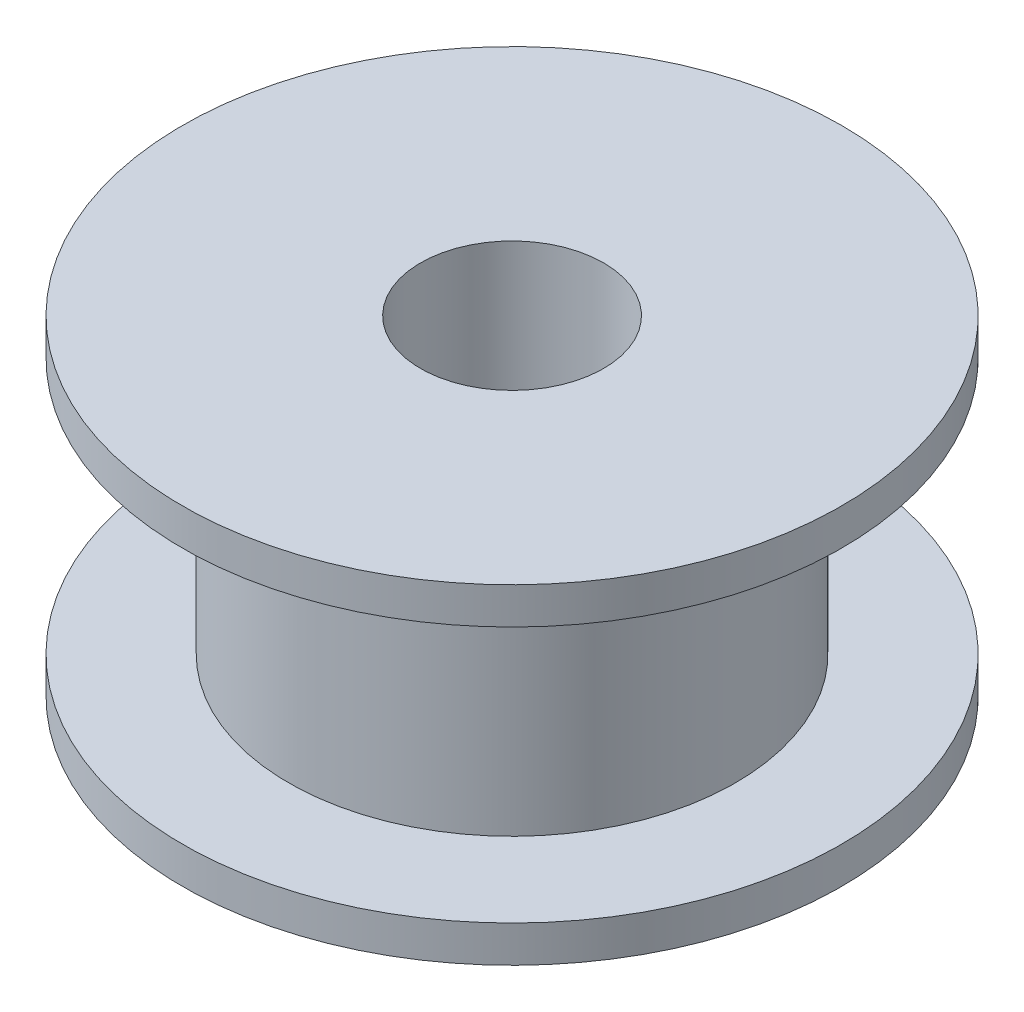
ISO-10303-21;
HEADER;
FILE_DESCRIPTION(('STEP AP214'),'2;1');
FILE_NAME('part.step','',(''),(''),'','','');
FILE_SCHEMA(('AUTOMOTIVE_DESIGN { 1 0 10303 214 1 1 1 1 }'));
ENDSEC;
DATA;
#1=APPLICATION_CONTEXT('core data for automotive mechanical design processes');
#2=APPLICATION_PROTOCOL_DEFINITION('international standard','automotive_design',2000,#1);
#3=PRODUCT_CONTEXT('',#1,'mechanical');
#4=PRODUCT('Part','Part','',(#3));
#5=PRODUCT_RELATED_PRODUCT_CATEGORY('part','',(#4));
#6=PRODUCT_DEFINITION_FORMATION('','',#4);
#7=PRODUCT_DEFINITION_CONTEXT('part definition',#1,'design');
#8=PRODUCT_DEFINITION('design','',#6,#7);
#9=PRODUCT_DEFINITION_SHAPE('','',#8);
#10=(LENGTH_UNIT() NAMED_UNIT(*) SI_UNIT(.MILLI.,.METRE.));
#11=(NAMED_UNIT(*) PLANE_ANGLE_UNIT() SI_UNIT($,.RADIAN.));
#12=(NAMED_UNIT(*) SI_UNIT($,.STERADIAN.) SOLID_ANGLE_UNIT());
#13=UNCERTAINTY_MEASURE_WITH_UNIT(LENGTH_MEASURE(1.E-05),#10,'distance_accuracy_value','');
#14=(GEOMETRIC_REPRESENTATION_CONTEXT(3) GLOBAL_UNCERTAINTY_ASSIGNED_CONTEXT((#13)) GLOBAL_UNIT_ASSIGNED_CONTEXT((#10,
#11,#12)) REPRESENTATION_CONTEXT('',''));
#15=CARTESIAN_POINT('',(0.,0.,0.));
#16=DIRECTION('',(0.,0.,1.));
#17=DIRECTION('',(1.,0.,0.));
#18=AXIS2_PLACEMENT_3D('',#15,#16,#17);
#19=CARTESIAN_POINT('',(9.,0.,0.));
#20=DIRECTION('',(0.,-1.,0.));
#21=DIRECTION('',(0.,0.,-1.));
#22=AXIS2_PLACEMENT_3D('',#19,#20,#21);
#23=PLANE('',#22);
#24=CARTESIAN_POINT('',(0.,0.,0.));
#25=DIRECTION('',(0.,-1.,0.));
#26=DIRECTION('',(0.,0.,-1.));
#27=AXIS2_PLACEMENT_3D('',#24,#25,#26);
#28=CIRCLE('',#27,9.);
#29=CARTESIAN_POINT('',(0.,0.,-9.));
#30=VERTEX_POINT('',#29);
#31=EDGE_CURVE('E63',#30,#30,#28,.T.);
#32=ORIENTED_EDGE('',*,*,#31,.T.);
#33=EDGE_LOOP('',(#32));
#34=FACE_BOUND('',#33,.T.);
#35=CARTESIAN_POINT('',(0.,0.,0.));
#36=DIRECTION('',(0.,-1.,0.));
#37=DIRECTION('',(0.,0.,-1.));
#38=AXIS2_PLACEMENT_3D('',#35,#36,#37);
#39=CIRCLE('',#38,2.5);
#40=CARTESIAN_POINT('',(0.,0.,-2.5));
#41=VERTEX_POINT('',#40);
#42=EDGE_CURVE('E10',#41,#41,#39,.T.);
#43=ORIENTED_EDGE('',*,*,#42,.F.);
#44=EDGE_LOOP('',(#43));
#45=FACE_BOUND('',#44,.T.);
#46=ADVANCED_FACE('F35',(#34,#45),#23,.T.);
#47=CARTESIAN_POINT('',(0.,-0.45,0.));
#48=DIRECTION('',(0.,-1.,0.));
#49=DIRECTION('',(0.,0.,-1.));
#50=AXIS2_PLACEMENT_3D('',#47,#48,#49);
#51=CYLINDRICAL_SURFACE('',#50,2.5);
#52=ORIENTED_EDGE('',*,*,#42,.T.);
#53=EDGE_LOOP('',(#52));
#54=FACE_BOUND('',#53,.T.);
#55=CARTESIAN_POINT('',(0.,9.,0.));
#56=DIRECTION('',(0.,-1.,0.));
#57=DIRECTION('',(0.,0.,-1.));
#58=AXIS2_PLACEMENT_3D('',#55,#56,#57);
#59=CIRCLE('',#58,2.5);
#60=CARTESIAN_POINT('',(0.,9.,-2.5));
#61=VERTEX_POINT('',#60);
#62=EDGE_CURVE('E41',#61,#61,#59,.T.);
#63=ORIENTED_EDGE('',*,*,#62,.F.);
#64=EDGE_LOOP('',(#63));
#65=FACE_BOUND('',#64,.T.);
#66=ADVANCED_FACE('F81',(#54,#65),#51,.F.);
#67=CARTESIAN_POINT('',(2.5,9.,0.));
#68=DIRECTION('',(0.,1.,0.));
#69=DIRECTION('',(0.,0.,1.));
#70=AXIS2_PLACEMENT_3D('',#67,#68,#69);
#71=PLANE('',#70);
#72=ORIENTED_EDGE('',*,*,#62,.T.);
#73=EDGE_LOOP('',(#72));
#74=FACE_BOUND('',#73,.T.);
#75=CARTESIAN_POINT('',(0.,9.,0.));
#76=DIRECTION('',(0.,-1.,0.));
#77=DIRECTION('',(0.,0.,-1.));
#78=AXIS2_PLACEMENT_3D('',#75,#76,#77);
#79=CIRCLE('',#78,9.);
#80=CARTESIAN_POINT('',(0.,9.,-9.));
#81=VERTEX_POINT('',#80);
#82=EDGE_CURVE('E45',#81,#81,#79,.T.);
#83=ORIENTED_EDGE('',*,*,#82,.F.);
#84=EDGE_LOOP('',(#83));
#85=FACE_BOUND('',#84,.T.);
#86=ADVANCED_FACE('F85',(#74,#85),#71,.T.);
#87=CARTESIAN_POINT('',(0.,-0.45,0.));
#88=DIRECTION('',(0.,-1.,0.));
#89=DIRECTION('',(0.,0.,-1.));
#90=AXIS2_PLACEMENT_3D('',#87,#88,#89);
#91=CYLINDRICAL_SURFACE('',#90,9.);
#92=ORIENTED_EDGE('',*,*,#82,.T.);
#93=EDGE_LOOP('',(#92));
#94=FACE_BOUND('',#93,.T.);
#95=CARTESIAN_POINT('',(0.,8.,0.));
#96=DIRECTION('',(0.,-1.,0.));
#97=DIRECTION('',(0.,0.,-1.));
#98=AXIS2_PLACEMENT_3D('',#95,#96,#97);
#99=CIRCLE('',#98,9.);
#100=CARTESIAN_POINT('',(0.,8.,-9.));
#101=VERTEX_POINT('',#100);
#102=EDGE_CURVE('E49',#101,#101,#99,.T.);
#103=ORIENTED_EDGE('',*,*,#102,.F.);
#104=EDGE_LOOP('',(#103));
#105=FACE_BOUND('',#104,.T.);
#106=ADVANCED_FACE('F89',(#94,#105),#91,.T.);
#107=CARTESIAN_POINT('',(6.1,8.,0.));
#108=DIRECTION('',(0.,-1.,0.));
#109=DIRECTION('',(0.,0.,-1.));
#110=AXIS2_PLACEMENT_3D('',#107,#108,#109);
#111=PLANE('',#110);
#112=ORIENTED_EDGE('',*,*,#102,.T.);
#113=EDGE_LOOP('',(#112));
#114=FACE_BOUND('',#113,.T.);
#115=CARTESIAN_POINT('',(0.,8.,0.));
#116=DIRECTION('',(0.,-1.,0.));
#117=DIRECTION('',(0.,0.,-1.));
#118=AXIS2_PLACEMENT_3D('',#115,#116,#117);
#119=CIRCLE('',#118,6.1);
#120=CARTESIAN_POINT('',(0.,8.,-6.1));
#121=VERTEX_POINT('',#120);
#122=EDGE_CURVE('E54',#121,#121,#119,.T.);
#123=ORIENTED_EDGE('',*,*,#122,.F.);
#124=EDGE_LOOP('',(#123));
#125=FACE_BOUND('',#124,.T.);
#126=ADVANCED_FACE('F95',(#114,#125),#111,.T.);
#127=CARTESIAN_POINT('',(0.,-0.45,0.));
#128=DIRECTION('',(0.,-1.,0.));
#129=DIRECTION('',(0.,0.,-1.));
#130=AXIS2_PLACEMENT_3D('',#127,#128,#129);
#131=CYLINDRICAL_SURFACE('',#130,6.1);
#132=ORIENTED_EDGE('',*,*,#122,.T.);
#133=EDGE_LOOP('',(#132));
#134=FACE_BOUND('',#133,.T.);
#135=CARTESIAN_POINT('',(0.,0.999999999999999,0.));
#136=DIRECTION('',(0.,-1.,0.));
#137=DIRECTION('',(0.,0.,-1.));
#138=AXIS2_PLACEMENT_3D('',#135,#136,#137);
#139=CIRCLE('',#138,6.1);
#140=CARTESIAN_POINT('',(0.,0.999999999999999,-6.1));
#141=VERTEX_POINT('',#140);
#142=EDGE_CURVE('E57',#141,#141,#139,.T.);
#143=ORIENTED_EDGE('',*,*,#142,.F.);
#144=EDGE_LOOP('',(#143));
#145=FACE_BOUND('',#144,.T.);
#146=ADVANCED_FACE('F77',(#134,#145),#131,.T.);
#147=CARTESIAN_POINT('',(9.,1.,0.));
#148=DIRECTION('',(0.,1.,0.));
#149=DIRECTION('',(0.,0.,1.));
#150=AXIS2_PLACEMENT_3D('',#147,#148,#149);
#151=PLANE('',#150);
#152=ORIENTED_EDGE('',*,*,#142,.T.);
#153=EDGE_LOOP('',(#152));
#154=FACE_BOUND('',#153,.T.);
#155=CARTESIAN_POINT('',(0.,1.,0.));
#156=DIRECTION('',(0.,-1.,0.));
#157=DIRECTION('',(0.,0.,-1.));
#158=AXIS2_PLACEMENT_3D('',#155,#156,#157);
#159=CIRCLE('',#158,9.);
#160=CARTESIAN_POINT('',(0.,1.,-9.));
#161=VERTEX_POINT('',#160);
#162=EDGE_CURVE('E60',#161,#161,#159,.T.);
#163=ORIENTED_EDGE('',*,*,#162,.F.);
#164=EDGE_LOOP('',(#163));
#165=FACE_BOUND('',#164,.T.);
#166=ADVANCED_FACE('F71',(#154,#165),#151,.T.);
#167=CARTESIAN_POINT('',(0.,-0.45,0.));
#168=DIRECTION('',(0.,-1.,0.));
#169=DIRECTION('',(0.,0.,-1.));
#170=AXIS2_PLACEMENT_3D('',#167,#168,#169);
#171=CYLINDRICAL_SURFACE('',#170,9.);
#172=ORIENTED_EDGE('',*,*,#162,.T.);
#173=EDGE_LOOP('',(#172));
#174=FACE_BOUND('',#173,.T.);
#175=ORIENTED_EDGE('',*,*,#31,.F.);
#176=EDGE_LOOP('',(#175));
#177=FACE_BOUND('',#176,.T.);
#178=ADVANCED_FACE('F69',(#174,#177),#171,.T.);
#179=CLOSED_SHELL('',(#46,#66,#86,#106,#126,#146,#166,#178));
#180=MANIFOLD_SOLID_BREP('B2',#179);
#181=ADVANCED_BREP_SHAPE_REPRESENTATION('',(#18,#180),#14);
#182=SHAPE_DEFINITION_REPRESENTATION(#9,#181);
ENDSEC;
END-ISO-10303-21;
